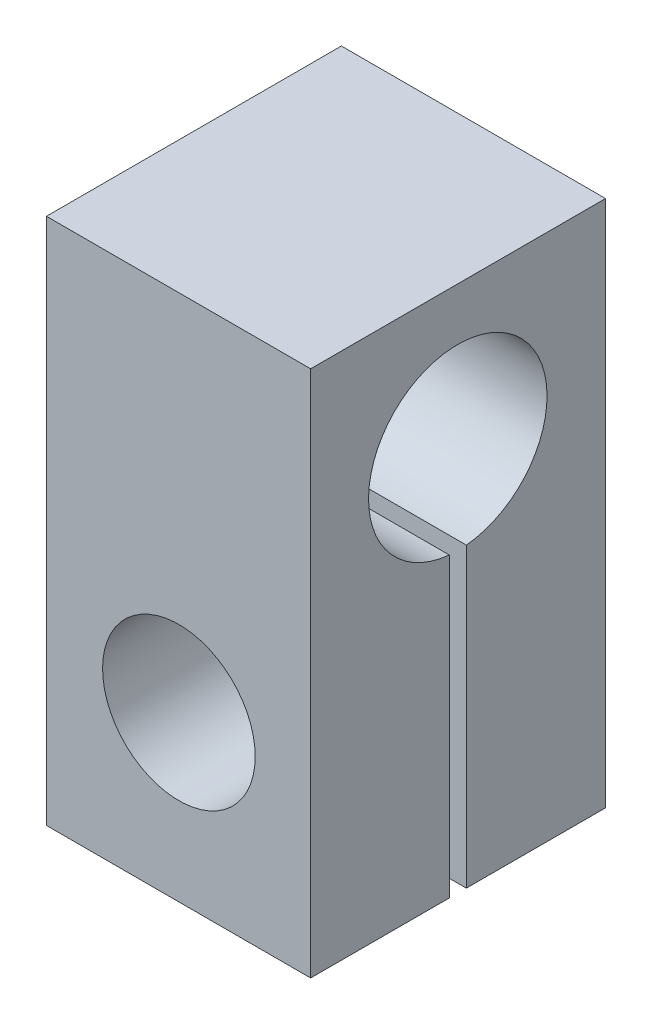
ISO-10303-21;
HEADER;
FILE_DESCRIPTION(('STEP AP214'),'2;1');
FILE_NAME('part.step','',(''),(''),'','','');
FILE_SCHEMA(('AUTOMOTIVE_DESIGN { 1 0 10303 214 1 1 1 1 }'));
ENDSEC;
DATA;
#1=APPLICATION_CONTEXT('core data for automotive mechanical design processes');
#2=APPLICATION_PROTOCOL_DEFINITION('international standard','automotive_design',2000,#1);
#3=PRODUCT_CONTEXT('',#1,'mechanical');
#4=PRODUCT('Part','Part','',(#3));
#5=PRODUCT_RELATED_PRODUCT_CATEGORY('part','',(#4));
#6=PRODUCT_DEFINITION_FORMATION('','',#4);
#7=PRODUCT_DEFINITION_CONTEXT('part definition',#1,'design');
#8=PRODUCT_DEFINITION('design','',#6,#7);
#9=PRODUCT_DEFINITION_SHAPE('','',#8);
#10=(LENGTH_UNIT() NAMED_UNIT(*) SI_UNIT(.MILLI.,.METRE.));
#11=(NAMED_UNIT(*) PLANE_ANGLE_UNIT() SI_UNIT($,.RADIAN.));
#12=(NAMED_UNIT(*) SI_UNIT($,.STERADIAN.) SOLID_ANGLE_UNIT());
#13=UNCERTAINTY_MEASURE_WITH_UNIT(LENGTH_MEASURE(1.E-05),#10,'distance_accuracy_value','');
#14=(GEOMETRIC_REPRESENTATION_CONTEXT(3) GLOBAL_UNCERTAINTY_ASSIGNED_CONTEXT((#13)) GLOBAL_UNIT_ASSIGNED_CONTEXT((#10,
#11,#12)) REPRESENTATION_CONTEXT('',''));
#15=CARTESIAN_POINT('',(0.,0.,0.));
#16=DIRECTION('',(0.,0.,1.));
#17=DIRECTION('',(1.,0.,0.));
#18=AXIS2_PLACEMENT_3D('',#15,#16,#17);
#19=CARTESIAN_POINT('',(4.5,-9.91643382354598,-4.20832578777919));
#20=DIRECTION('',(0.,0.999999923726654,-0.000390572255170123));
#21=DIRECTION('',(0.,0.000390572255170123,0.999999923726654));
#22=AXIS2_PLACEMENT_3D('',#19,#20,#21);
#23=PLANE('',#22);
#24=DIRECTION('',(0.,-0.000390572255170123,-0.999999923726654));
#25=VECTOR('',#24,1.);
#26=CARTESIAN_POINT('',(0.,-9.91643382354598,-4.20832578777919));
#27=LINE('',#26,#25);
#28=CARTESIAN_POINT('',(0.,-9.91643382354598,-4.20832578777919));
#29=VERTEX_POINT('',#28);
#30=CARTESIAN_POINT('',(0.,-9.91736000646712,-6.57967408053012));
#31=VERTEX_POINT('',#30);
#32=EDGE_CURVE('E141',#29,#31,#27,.T.);
#33=ORIENTED_EDGE('',*,*,#32,.T.);
#34=DIRECTION('',(-1.,0.,0.));
#35=VECTOR('',#34,1.);
#36=CARTESIAN_POINT('',(4.5,-9.91736000646712,-6.57967408053012));
#37=LINE('',#36,#35);
#38=CARTESIAN_POINT('',(4.5,-9.91736000646712,-6.57967408053012));
#39=VERTEX_POINT('',#38);
#40=EDGE_CURVE('E11',#39,#31,#37,.T.);
#41=ORIENTED_EDGE('',*,*,#40,.F.);
#42=DIRECTION('',(0.,-0.000390572255170123,-0.999999923726654));
#43=VECTOR('',#42,1.);
#44=CARTESIAN_POINT('',(4.5,-9.91643382354598,-4.20832578777919));
#45=LINE('',#44,#43);
#46=CARTESIAN_POINT('',(4.5,-9.91643382354598,-4.20832578777919));
#47=VERTEX_POINT('',#46);
#48=EDGE_CURVE('E164',#47,#39,#45,.T.);
#49=ORIENTED_EDGE('',*,*,#48,.F.);
#50=DIRECTION('',(-1.,0.,0.));
#51=VECTOR('',#50,1.);
#52=CARTESIAN_POINT('',(4.5,-9.91643382354598,-4.20832578777919));
#53=LINE('',#52,#51);
#54=EDGE_CURVE('E137',#47,#29,#53,.T.);
#55=ORIENTED_EDGE('',*,*,#54,.T.);
#56=EDGE_LOOP('',(#33,#41,#49,#55));
#57=FACE_BOUND('',#56,.T.);
#58=ADVANCED_FACE('F39',(#57),#23,.F.);
#59=CARTESIAN_POINT('',(4.5,-9.91736000646712,-6.57967408053012));
#60=DIRECTION('',(0.,0.,1.));
#61=DIRECTION('',(1.,0.,0.));
#62=AXIS2_PLACEMENT_3D('',#59,#60,#61);
#63=PLANE('',#62);
#64=CARTESIAN_POINT('',(2.25602954331805,-7.12173193538312,-6.57967408053012));
#65=DIRECTION('',(0.,0.,1.));
#66=DIRECTION('',(1.,0.,0.));
#67=AXIS2_PLACEMENT_3D('',#64,#65,#66);
#68=CIRCLE('',#67,1.3);
#69=CARTESIAN_POINT('',(3.55602954331805,-7.12173193538312,-6.57967408053012));
#70=VERTEX_POINT('',#69);
#71=EDGE_CURVE('E146',#70,#70,#68,.T.);
#72=ORIENTED_EDGE('',*,*,#71,.T.);
#73=EDGE_LOOP('',(#72));
#74=FACE_BOUND('',#73,.T.);
#75=DIRECTION('',(0.,1.,0.));
#76=VECTOR('',#75,1.);
#77=CARTESIAN_POINT('',(0.,-9.91736000646712,-6.57967408053012));
#78=LINE('',#77,#76);
#79=CARTESIAN_POINT('',(0.,-0.928463249188956,-6.57967408053012));
#80=VERTEX_POINT('',#79);
#81=EDGE_CURVE('E145',#31,#80,#78,.T.);
#82=ORIENTED_EDGE('',*,*,#81,.T.);
#83=DIRECTION('',(-1.,0.,0.));
#84=VECTOR('',#83,1.);
#85=CARTESIAN_POINT('',(4.5,-0.928463249188956,-6.57967408053012));
#86=LINE('',#85,#84);
#87=CARTESIAN_POINT('',(4.5,-0.928463249188956,-6.57967408053012));
#88=VERTEX_POINT('',#87);
#89=EDGE_CURVE('E49',#88,#80,#86,.T.);
#90=ORIENTED_EDGE('',*,*,#89,.F.);
#91=DIRECTION('',(0.,1.,0.));
#92=VECTOR('',#91,1.);
#93=CARTESIAN_POINT('',(4.5,-9.91736000646712,-6.57967408053012));
#94=LINE('',#93,#92);
#95=EDGE_CURVE('E100',#39,#88,#94,.T.);
#96=ORIENTED_EDGE('',*,*,#95,.F.);
#97=ORIENTED_EDGE('',*,*,#40,.T.);
#98=EDGE_LOOP('',(#82,#90,#96,#97));
#99=FACE_BOUND('',#98,.T.);
#100=ADVANCED_FACE('F234',(#74,#99),#63,.F.);
#101=CARTESIAN_POINT('',(4.5,-0.928463249188956,-1.55613054033977));
#102=DIRECTION('',(0.,-1.,0.));
#103=DIRECTION('',(0.,0.,-1.));
#104=AXIS2_PLACEMENT_3D('',#101,#102,#103);
#105=PLANE('',#104);
#106=DIRECTION('',(0.,0.,1.));
#107=VECTOR('',#106,1.);
#108=CARTESIAN_POINT('',(0.,-0.928463249188956,-1.55613054033977));
#109=LINE('',#108,#107);
#110=CARTESIAN_POINT('',(0.,-0.928463249188956,-1.55613054033977));
#111=VERTEX_POINT('',#110);
#112=EDGE_CURVE('E149',#80,#111,#109,.T.);
#113=ORIENTED_EDGE('',*,*,#112,.T.);
#114=DIRECTION('',(-1.,0.,0.));
#115=VECTOR('',#114,1.);
#116=CARTESIAN_POINT('',(4.5,-0.928463249188956,-1.55613054033977));
#117=LINE('',#116,#115);
#118=CARTESIAN_POINT('',(4.5,-0.928463249188956,-1.55613054033977));
#119=VERTEX_POINT('',#118);
#120=EDGE_CURVE('E175',#119,#111,#117,.T.);
#121=ORIENTED_EDGE('',*,*,#120,.F.);
#122=DIRECTION('',(0.,0.,1.));
#123=VECTOR('',#122,1.);
#124=CARTESIAN_POINT('',(4.5,-0.928463249188956,-1.55613054033977));
#125=LINE('',#124,#123);
#126=EDGE_CURVE('E186',#88,#119,#125,.T.);
#127=ORIENTED_EDGE('',*,*,#126,.F.);
#128=ORIENTED_EDGE('',*,*,#89,.T.);
#129=EDGE_LOOP('',(#113,#121,#127,#128));
#130=FACE_BOUND('',#129,.T.);
#131=ADVANCED_FACE('F184',(#130),#105,.F.);
#132=CARTESIAN_POINT('',(4.5,-0.928463249188956,-1.55613054033977));
#133=DIRECTION('',(0.,0.,-1.));
#134=DIRECTION('',(-1.,0.,0.));
#135=AXIS2_PLACEMENT_3D('',#132,#133,#134);
#136=PLANE('',#135);
#137=CARTESIAN_POINT('',(2.25602954331805,-7.12173193538312,-1.55613054033977));
#138=DIRECTION('',(0.,0.,1.));
#139=DIRECTION('',(1.,0.,0.));
#140=AXIS2_PLACEMENT_3D('',#137,#138,#139);
#141=CIRCLE('',#140,1.3);
#142=CARTESIAN_POINT('',(3.55602954331805,-7.12173193538312,-1.55613054033977));
#143=VERTEX_POINT('',#142);
#144=EDGE_CURVE('E216',#143,#143,#141,.T.);
#145=ORIENTED_EDGE('',*,*,#144,.F.);
#146=EDGE_LOOP('',(#145));
#147=FACE_BOUND('',#146,.T.);
#148=DIRECTION('',(0.,-1.,0.));
#149=VECTOR('',#148,1.);
#150=CARTESIAN_POINT('',(0.,-0.928463249188956,-1.55613054033977));
#151=LINE('',#150,#149);
#152=CARTESIAN_POINT('',(0.,-9.91539794958803,-1.55613054033977));
#153=VERTEX_POINT('',#152);
#154=EDGE_CURVE('E152',#111,#153,#151,.T.);
#155=ORIENTED_EDGE('',*,*,#154,.T.);
#156=DIRECTION('',(-1.,0.,0.));
#157=VECTOR('',#156,1.);
#158=CARTESIAN_POINT('',(4.5,-9.91539794958803,-1.55613054033977));
#159=LINE('',#158,#157);
#160=CARTESIAN_POINT('',(4.5,-9.91539794958803,-1.55613054033977));
#161=VERTEX_POINT('',#160);
#162=EDGE_CURVE('E171',#161,#153,#159,.T.);
#163=ORIENTED_EDGE('',*,*,#162,.F.);
#164=DIRECTION('',(0.,-1.,0.));
#165=VECTOR('',#164,1.);
#166=CARTESIAN_POINT('',(4.5,-0.928463249188956,-1.55613054033977));
#167=LINE('',#166,#165);
#168=EDGE_CURVE('E199',#119,#161,#167,.T.);
#169=ORIENTED_EDGE('',*,*,#168,.F.);
#170=ORIENTED_EDGE('',*,*,#120,.T.);
#171=EDGE_LOOP('',(#155,#163,#169,#170));
#172=FACE_BOUND('',#171,.T.);
#173=ADVANCED_FACE('F194',(#147,#172),#136,.F.);
#174=CARTESIAN_POINT('',(4.5,-9.91539794958803,-1.55613054033977));
#175=DIRECTION('',(0.,0.999999923726654,-0.00039057225516928));
#176=DIRECTION('',(0.,0.00039057225516928,0.999999923726654));
#177=AXIS2_PLACEMENT_3D('',#174,#175,#176);
#178=PLANE('',#177);
#179=DIRECTION('',(0.,-0.00039057225516928,-0.999999923726654));
#180=VECTOR('',#179,1.);
#181=CARTESIAN_POINT('',(0.,-9.91539794958803,-1.55613054033977));
#182=LINE('',#181,#180);
#183=CARTESIAN_POINT('',(0.,-9.91632031855928,-3.91771380358104));
#184=VERTEX_POINT('',#183);
#185=EDGE_CURVE('E155',#153,#184,#182,.T.);
#186=ORIENTED_EDGE('',*,*,#185,.T.);
#187=DIRECTION('',(-1.,0.,0.));
#188=VECTOR('',#187,1.);
#189=CARTESIAN_POINT('',(4.5,-9.91632031855928,-3.91771380358104));
#190=LINE('',#189,#188);
#191=CARTESIAN_POINT('',(4.5,-9.91632031855928,-3.91771380358104));
#192=VERTEX_POINT('',#191);
#193=EDGE_CURVE('E130',#192,#184,#190,.T.);
#194=ORIENTED_EDGE('',*,*,#193,.F.);
#195=DIRECTION('',(0.,-0.00039057225516928,-0.999999923726654));
#196=VECTOR('',#195,1.);
#197=CARTESIAN_POINT('',(4.5,-9.91539794958803,-1.55613054033977));
#198=LINE('',#197,#196);
#199=EDGE_CURVE('E119',#161,#192,#198,.T.);
#200=ORIENTED_EDGE('',*,*,#199,.F.);
#201=ORIENTED_EDGE('',*,*,#162,.T.);
#202=EDGE_LOOP('',(#186,#194,#200,#201));
#203=FACE_BOUND('',#202,.T.);
#204=ADVANCED_FACE('F197',(#203),#178,.F.);
#205=CARTESIAN_POINT('',(4.5,-4.85549859568574,-3.91771380358104));
#206=DIRECTION('',(0.,0.,1.));
#207=DIRECTION('',(1.,0.,0.));
#208=AXIS2_PLACEMENT_3D('',#205,#206,#207);
#209=PLANE('',#208);
#210=CARTESIAN_POINT('',(2.25602954331805,-7.12173193538312,-3.91771380358104));
#211=DIRECTION('',(0.,0.,1.));
#212=DIRECTION('',(1.,0.,0.));
#213=AXIS2_PLACEMENT_3D('',#210,#211,#212);
#214=CIRCLE('',#213,1.3);
#215=CARTESIAN_POINT('',(3.55602954331805,-7.12173193538312,-3.91771380358104));
#216=VERTEX_POINT('',#215);
#217=EDGE_CURVE('E212',#216,#216,#214,.T.);
#218=ORIENTED_EDGE('',*,*,#217,.T.);
#219=EDGE_LOOP('',(#218));
#220=FACE_BOUND('',#219,.T.);
#221=DIRECTION('',(0.,1.,0.));
#222=VECTOR('',#221,1.);
#223=CARTESIAN_POINT('',(0.,-4.85549859568574,-3.91771380358104));
#224=LINE('',#223,#222);
#225=CARTESIAN_POINT('',(0.,-4.85549859568574,-3.91771380358104));
#226=VERTEX_POINT('',#225);
#227=EDGE_CURVE('E128',#184,#226,#224,.T.);
#228=ORIENTED_EDGE('',*,*,#227,.T.);
#229=DIRECTION('',(-1.,0.,0.));
#230=VECTOR('',#229,1.);
#231=CARTESIAN_POINT('',(4.5,-4.85549859568574,-3.91771380358104));
#232=LINE('',#231,#230);
#233=CARTESIAN_POINT('',(4.5,-4.85549859568574,-3.91771380358104));
#234=VERTEX_POINT('',#233);
#235=EDGE_CURVE('E125',#234,#226,#232,.T.);
#236=ORIENTED_EDGE('',*,*,#235,.F.);
#237=DIRECTION('',(0.,1.,0.));
#238=VECTOR('',#237,1.);
#239=CARTESIAN_POINT('',(4.5,-4.85549859568574,-3.91771380358104));
#240=LINE('',#239,#238);
#241=EDGE_CURVE('E113',#192,#234,#240,.T.);
#242=ORIENTED_EDGE('',*,*,#241,.F.);
#243=ORIENTED_EDGE('',*,*,#193,.T.);
#244=EDGE_LOOP('',(#228,#236,#242,#243));
#245=FACE_BOUND('',#244,.T.);
#246=ADVANCED_FACE('F126',(#220,#245),#209,.F.);
#247=CARTESIAN_POINT('',(4.5,-3.34244148680697,-4.0628281904331));
#248=DIRECTION('',(-1.,0.,0.));
#249=DIRECTION('',(0.,0.,1.));
#250=AXIS2_PLACEMENT_3D('',#247,#248,#249);
#251=CYLINDRICAL_SURFACE('',#250,1.52);
#252=CARTESIAN_POINT('',(0.,-3.34244148680697,-4.0628281904331));
#253=DIRECTION('',(-1.,0.,0.));
#254=DIRECTION('',(0.,0.,-1.));
#255=AXIS2_PLACEMENT_3D('',#252,#253,#254);
#256=CIRCLE('',#255,1.52);
#257=CARTESIAN_POINT('',(0.,-4.85546179373168,-4.20832578777919));
#258=VERTEX_POINT('',#257);
#259=EDGE_CURVE('E86',#226,#258,#256,.T.);
#260=ORIENTED_EDGE('',*,*,#259,.T.);
#261=DIRECTION('',(-1.,0.,0.));
#262=VECTOR('',#261,1.);
#263=CARTESIAN_POINT('',(4.5,-4.85546179373168,-4.20832578777919));
#264=LINE('',#263,#262);
#265=CARTESIAN_POINT('',(4.5,-4.85546179373168,-4.20832578777919));
#266=VERTEX_POINT('',#265);
#267=EDGE_CURVE('E131',#266,#258,#264,.T.);
#268=ORIENTED_EDGE('',*,*,#267,.F.);
#269=CARTESIAN_POINT('',(4.5,-3.34244148680697,-4.0628281904331));
#270=DIRECTION('',(-1.,0.,0.));
#271=DIRECTION('',(0.,0.,-1.));
#272=AXIS2_PLACEMENT_3D('',#269,#270,#271);
#273=CIRCLE('',#272,1.52);
#274=EDGE_CURVE('E117',#234,#266,#273,.T.);
#275=ORIENTED_EDGE('',*,*,#274,.F.);
#276=ORIENTED_EDGE('',*,*,#235,.T.);
#277=EDGE_LOOP('',(#260,#268,#275,#276));
#278=FACE_BOUND('',#277,.T.);
#279=ADVANCED_FACE('F133',(#278),#251,.F.);
#280=CARTESIAN_POINT('',(4.5,-4.85546179373168,-4.20832578777919));
#281=DIRECTION('',(0.,0.,-1.));
#282=DIRECTION('',(-1.,0.,0.));
#283=AXIS2_PLACEMENT_3D('',#280,#281,#282);
#284=PLANE('',#283);
#285=CARTESIAN_POINT('',(2.25602954331805,-7.12173193538312,-4.20832578777919));
#286=DIRECTION('',(0.,0.,-1.));
#287=DIRECTION('',(-1.,0.,0.));
#288=AXIS2_PLACEMENT_3D('',#285,#286,#287);
#289=CIRCLE('',#288,1.3);
#290=CARTESIAN_POINT('',(0.95602954331805,-7.12173193538312,-4.20832578777919));
#291=VERTEX_POINT('',#290);
#292=EDGE_CURVE('E42',#291,#291,#289,.T.);
#293=ORIENTED_EDGE('',*,*,#292,.T.);
#294=EDGE_LOOP('',(#293));
#295=FACE_BOUND('',#294,.T.);
#296=DIRECTION('',(0.,-1.,0.));
#297=VECTOR('',#296,1.);
#298=CARTESIAN_POINT('',(0.,-4.85546179373168,-4.20832578777919));
#299=LINE('',#298,#297);
#300=EDGE_CURVE('E92',#258,#29,#299,.T.);
#301=ORIENTED_EDGE('',*,*,#300,.T.);
#302=ORIENTED_EDGE('',*,*,#54,.F.);
#303=DIRECTION('',(0.,-1.,0.));
#304=VECTOR('',#303,1.);
#305=CARTESIAN_POINT('',(4.5,-4.85546179373168,-4.20832578777919));
#306=LINE('',#305,#304);
#307=EDGE_CURVE('E57',#266,#47,#306,.T.);
#308=ORIENTED_EDGE('',*,*,#307,.F.);
#309=ORIENTED_EDGE('',*,*,#267,.T.);
#310=EDGE_LOOP('',(#301,#302,#308,#309));
#311=FACE_BOUND('',#310,.T.);
#312=ADVANCED_FACE('F225',(#295,#311),#284,.F.);
#313=CARTESIAN_POINT('',(4.5,-3.34244148680697,-4.0628281904331));
#314=DIRECTION('',(1.,0.,0.));
#315=DIRECTION('',(0.,0.,-1.));
#316=AXIS2_PLACEMENT_3D('',#313,#314,#315);
#317=PLANE('',#316);
#318=ORIENTED_EDGE('',*,*,#48,.T.);
#319=ORIENTED_EDGE('',*,*,#95,.T.);
#320=ORIENTED_EDGE('',*,*,#126,.T.);
#321=ORIENTED_EDGE('',*,*,#168,.T.);
#322=ORIENTED_EDGE('',*,*,#199,.T.);
#323=ORIENTED_EDGE('',*,*,#241,.T.);
#324=ORIENTED_EDGE('',*,*,#274,.T.);
#325=ORIENTED_EDGE('',*,*,#307,.T.);
#326=EDGE_LOOP('',(#318,#319,#320,#321,#322,#323,#324,#325));
#327=FACE_BOUND('',#326,.T.);
#328=ADVANCED_FACE('F115',(#327),#317,.T.);
#329=CARTESIAN_POINT('',(0.,-3.34244148680697,-4.0628281904331));
#330=DIRECTION('',(1.,0.,0.));
#331=DIRECTION('',(0.,0.,-1.));
#332=AXIS2_PLACEMENT_3D('',#329,#330,#331);
#333=PLANE('',#332);
#334=ORIENTED_EDGE('',*,*,#32,.F.);
#335=ORIENTED_EDGE('',*,*,#300,.F.);
#336=ORIENTED_EDGE('',*,*,#259,.F.);
#337=ORIENTED_EDGE('',*,*,#227,.F.);
#338=ORIENTED_EDGE('',*,*,#185,.F.);
#339=ORIENTED_EDGE('',*,*,#154,.F.);
#340=ORIENTED_EDGE('',*,*,#112,.F.);
#341=ORIENTED_EDGE('',*,*,#81,.F.);
#342=EDGE_LOOP('',(#334,#335,#336,#337,#338,#339,#340,#341));
#343=FACE_BOUND('',#342,.T.);
#344=ADVANCED_FACE('F190',(#343),#333,.F.);
#345=CARTESIAN_POINT('',(2.25602954331805,-7.12173193538312,-12.0561305403398));
#346=DIRECTION('',(0.,0.,1.));
#347=DIRECTION('',(1.,0.,0.));
#348=AXIS2_PLACEMENT_3D('',#345,#346,#347);
#349=CYLINDRICAL_SURFACE('',#348,1.3);
#350=ORIENTED_EDGE('',*,*,#292,.F.);
#351=EDGE_LOOP('',(#350));
#352=FACE_BOUND('',#351,.T.);
#353=ORIENTED_EDGE('',*,*,#71,.F.);
#354=EDGE_LOOP('',(#353));
#355=FACE_BOUND('',#354,.T.);
#356=ADVANCED_FACE('F227',(#352,#355),#349,.F.);
#357=ORIENTED_EDGE('',*,*,#144,.T.);
#358=EDGE_LOOP('',(#357));
#359=FACE_BOUND('',#358,.T.);
#360=ORIENTED_EDGE('',*,*,#217,.F.);
#361=EDGE_LOOP('',(#360));
#362=FACE_BOUND('',#361,.T.);
#363=ADVANCED_FACE('F230',(#359,#362),#349,.F.);
#364=CLOSED_SHELL('',(#58,#100,#131,#173,#204,#246,#279,#312,#328,#344,#356,#363));
#365=MANIFOLD_SOLID_BREP('B2',#364);
#366=ADVANCED_BREP_SHAPE_REPRESENTATION('',(#18,#365),#14);
#367=SHAPE_DEFINITION_REPRESENTATION(#9,#366);
ENDSEC;
END-ISO-10303-21;
